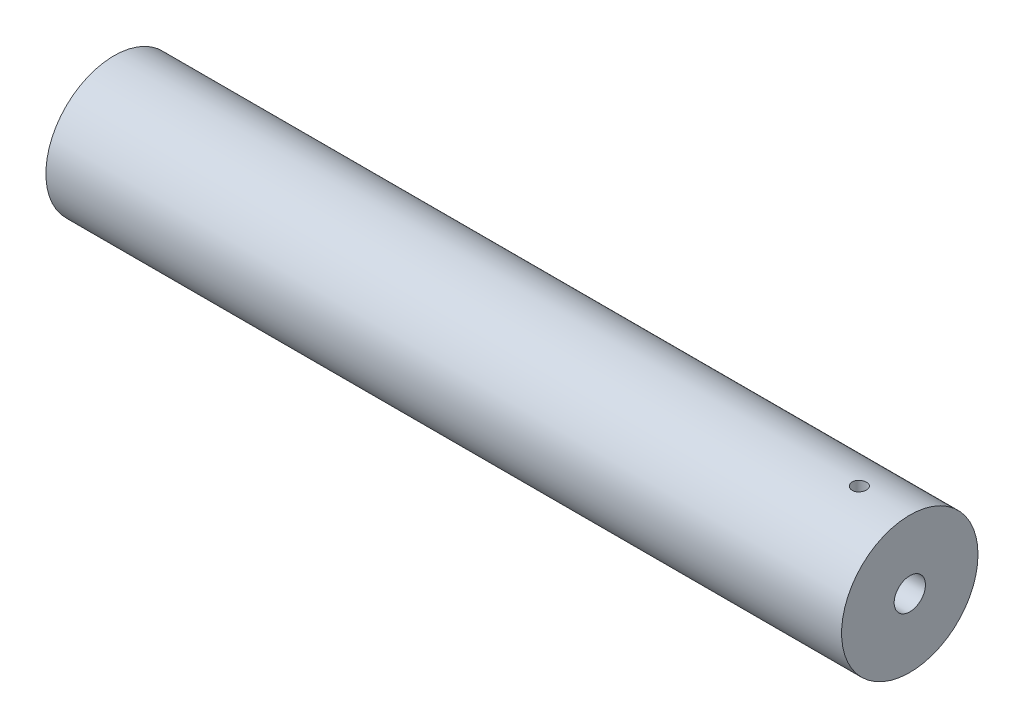
ISO-10303-21;
HEADER;
FILE_DESCRIPTION(('STEP AP214'),'2;1');
FILE_NAME('part.step','',(''),(''),'','','');
FILE_SCHEMA(('AUTOMOTIVE_DESIGN { 1 0 10303 214 1 1 1 1 }'));
ENDSEC;
DATA;
#1=APPLICATION_CONTEXT('core data for automotive mechanical design processes');
#2=APPLICATION_PROTOCOL_DEFINITION('international standard','automotive_design',2000,#1);
#3=PRODUCT_CONTEXT('',#1,'mechanical');
#4=PRODUCT('Part','Part','',(#3));
#5=PRODUCT_RELATED_PRODUCT_CATEGORY('part','',(#4));
#6=PRODUCT_DEFINITION_FORMATION('','',#4);
#7=PRODUCT_DEFINITION_CONTEXT('part definition',#1,'design');
#8=PRODUCT_DEFINITION('design','',#6,#7);
#9=PRODUCT_DEFINITION_SHAPE('','',#8);
#10=(LENGTH_UNIT() NAMED_UNIT(*) SI_UNIT(.MILLI.,.METRE.));
#11=(NAMED_UNIT(*) PLANE_ANGLE_UNIT() SI_UNIT($,.RADIAN.));
#12=(NAMED_UNIT(*) SI_UNIT($,.STERADIAN.) SOLID_ANGLE_UNIT());
#13=UNCERTAINTY_MEASURE_WITH_UNIT(LENGTH_MEASURE(1.E-05),#10,'distance_accuracy_value','');
#14=(GEOMETRIC_REPRESENTATION_CONTEXT(3) GLOBAL_UNCERTAINTY_ASSIGNED_CONTEXT((#13)) GLOBAL_UNIT_ASSIGNED_CONTEXT((#10,
#11,#12)) REPRESENTATION_CONTEXT('',''));
#15=CARTESIAN_POINT('',(0.,0.,0.));
#16=DIRECTION('',(0.,0.,1.));
#17=DIRECTION('',(1.,0.,0.));
#18=AXIS2_PLACEMENT_3D('',#15,#16,#17);
#19=CARTESIAN_POINT('',(131.130079525463,-120.,0.));
#20=DIRECTION('',(0.,1.,0.));
#21=DIRECTION('',(0.,0.,1.));
#22=AXIS2_PLACEMENT_3D('',#19,#20,#21);
#23=CYLINDRICAL_SURFACE('',#22,1.25000000000001);
#24=CARTESIAN_POINT('',(131.130079525463,-2.44948974278317,1.25000000000001));
#25=CARTESIAN_POINT('',(131.196087954239,-2.44949368228764,1.24999649350402));
#26=CARTESIAN_POINT('',(131.262199347476,-2.45219701957714,1.2447378244484));
#27=CARTESIAN_POINT('',(131.392461876427,-2.46264090706275,1.22393957837269));
#28=CARTESIAN_POINT('',(131.456607776006,-2.47039386281898,1.20837468013773));
#29=CARTESIAN_POINT('',(131.580818059726,-2.48986254372279,1.16772642001969));
#30=CARTESIAN_POINT('',(131.640899759733,-2.50155999360654,1.14268689094075));
#31=CARTESIAN_POINT('',(131.7559946184,-2.52757186133795,1.08393224916965));
#32=CARTESIAN_POINT('',(131.811008313043,-2.54188600196966,1.05021805532982));
#33=CARTESIAN_POINT('',(131.918526662095,-2.57270625364896,0.972392408700594));
#34=CARTESIAN_POINT('',(131.970610757711,-2.58929511801968,0.927732432282898));
#35=CARTESIAN_POINT('',(132.06686779967,-2.62212163999063,0.830430066961095));
#36=CARTESIAN_POINT('',(132.111037338476,-2.63835914368329,0.777784257759791));
#37=CARTESIAN_POINT('',(132.192505091893,-2.66969243866209,0.662562027156257));
#38=CARTESIAN_POINT('',(132.229310872708,-2.68468107121253,0.599605600022176));
#39=CARTESIAN_POINT('',(132.291622021179,-2.71078910043921,0.467587746509033));
#40=CARTESIAN_POINT('',(132.317133313559,-2.72191052506912,0.398529543785725));
#41=CARTESIAN_POINT('',(132.354546692516,-2.73844039615752,0.260702263713044));
#42=CARTESIAN_POINT('',(132.367179274127,-2.74415398467794,0.192168860207251));
#43=CARTESIAN_POINT('',(132.380856765775,-2.75034616684861,0.0537337492110859));
#44=CARTESIAN_POINT('',(132.381907340996,-2.75082731987365,-0.0161672725634469));
#45=CARTESIAN_POINT('',(132.372730512016,-2.74666518415707,-0.149965080853608));
#46=CARTESIAN_POINT('',(132.363311657815,-2.74238926124843,-0.2139310798263));
#47=CARTESIAN_POINT('',(132.334875592288,-2.72972015837754,-0.339258309266323));
#48=CARTESIAN_POINT('',(132.315857669237,-2.72132667311912,-0.40061934622245));
#49=CARTESIAN_POINT('',(132.268569509568,-2.70105493201454,-0.520129625913231));
#50=CARTESIAN_POINT('',(132.24016363026,-2.68912586975713,-0.578216222535312));
#51=CARTESIAN_POINT('',(132.17505685861,-2.66291017293157,-0.68894998656134));
#52=CARTESIAN_POINT('',(132.13835292804,-2.64862267537057,-0.741595151340284));
#53=CARTESIAN_POINT('',(132.054229769819,-2.61770923899541,-0.844521462680999));
#54=CARTESIAN_POINT('',(132.006180878326,-2.60098761803526,-0.894259880394277));
#55=CARTESIAN_POINT('',(131.90246240245,-2.56790977516793,-0.985234665281759));
#56=CARTESIAN_POINT('',(131.846788708995,-2.55155375585301,-1.02646641790382));
#57=CARTESIAN_POINT('',(131.726269575822,-2.52029978809172,-1.10104506894184));
#58=CARTESIAN_POINT('',(131.661123275473,-2.50550118974752,-1.13395121798235));
#59=CARTESIAN_POINT('',(131.525369195309,-2.48028797326794,-1.18809667415592));
#60=CARTESIAN_POINT('',(131.454766225228,-2.46986954528397,-1.20934612514666));
#61=CARTESIAN_POINT('',(131.315551315028,-2.45559834607938,-1.23805393738083));
#62=CARTESIAN_POINT('',(131.247167214568,-2.45132366398272,-1.2464018641072));
#63=CARTESIAN_POINT('',(131.109856228252,-2.44861334601462,-1.25172089001373));
#64=CARTESIAN_POINT('',(131.040929614163,-2.4501749518254,-1.24869736351008));
#65=CARTESIAN_POINT('',(130.910511258509,-2.45851920297553,-1.23217422693462));
#66=CARTESIAN_POINT('',(130.848875197682,-2.46486058692079,-1.21955926621108));
#67=CARTESIAN_POINT('',(130.728671928036,-2.48144703005368,-1.18544405201491));
#68=CARTESIAN_POINT('',(130.67010553996,-2.49169312725521,-1.16394143575356));
#69=CARTESIAN_POINT('',(130.554714289263,-2.51549375704146,-1.11159822979468));
#70=CARTESIAN_POINT('',(130.498089153042,-2.52917735570445,-1.08037807246867));
#71=CARTESIAN_POINT('',(130.390579924912,-2.55815836558198,-1.00984087724325));
#72=CARTESIAN_POINT('',(130.339698618428,-2.57345655287928,-0.97051993682405));
#73=CARTESIAN_POINT('',(130.239798219525,-2.60579094908277,-0.880267857698446));
#74=CARTESIAN_POINT('',(130.191477291788,-2.62284763397896,-0.828567938261544));
#75=CARTESIAN_POINT('',(130.104030412188,-2.65539591051489,-0.717441468187298));
#76=CARTESIAN_POINT('',(130.064906031443,-2.67088723447428,-0.658013600012931));
#77=CARTESIAN_POINT('',(129.996682042138,-2.69881612600612,-0.532064634336928));
#78=CARTESIAN_POINT('',(129.967699331786,-2.71121763780736,-0.465471699055611));
#79=CARTESIAN_POINT('',(129.921599069129,-2.73129834562412,-0.327635980482068));
#80=CARTESIAN_POINT('',(129.904472967649,-2.73898094374761,-0.256396588146305));
#81=CARTESIAN_POINT('',(129.883791935399,-2.74830068808534,-0.117466176582608));
#82=CARTESIAN_POINT('',(129.879257831228,-2.75037367442807,-0.0499494636179563));
#83=CARTESIAN_POINT('',(129.881145397558,-2.74951533998594,0.0848898576599922));
#84=CARTESIAN_POINT('',(129.887564430947,-2.74658522376394,0.15221250878732));
#85=CARTESIAN_POINT('',(129.910482302736,-2.73629690997646,0.281391999197476));
#86=CARTESIAN_POINT('',(129.926483425803,-2.72915761294651,0.343356169931394));
#87=CARTESIAN_POINT('',(129.9675145692,-2.71131278427637,0.463664188063018));
#88=CARTESIAN_POINT('',(129.992546121148,-2.70060664770133,0.522007419358057));
#89=CARTESIAN_POINT('',(130.052178066892,-2.6760233581899,0.636378008545805));
#90=CARTESIAN_POINT('',(130.087163708767,-2.66202358016365,0.692177439915805));
#91=CARTESIAN_POINT('',(130.165190306005,-2.63243399966462,0.797359045105189));
#92=CARTESIAN_POINT('',(130.208234781832,-2.61684350365392,0.846738398309331));
#93=CARTESIAN_POINT('',(130.305322290193,-2.58417614823031,0.941951228398695));
#94=CARTESIAN_POINT('',(130.359980422705,-2.56708296999995,0.987154004244772));
#95=CARTESIAN_POINT('',(130.47653812512,-2.53455914709153,1.06790018403237));
#96=CARTESIAN_POINT('',(130.53844242996,-2.5191296022894,1.10343722102545));
#97=CARTESIAN_POINT('',(130.668591982971,-2.49176565985743,1.16392442382467));
#98=CARTESIAN_POINT('',(130.736883750486,-2.47986003874526,1.18878813351711));
#99=CARTESIAN_POINT('',(130.877315359654,-2.46152275925821,1.22631765086684));
#100=CARTESIAN_POINT('',(130.949441414717,-2.45507273502283,1.23902440311468));
#101=CARTESIAN_POINT('',(131.04007062356,-2.45107611117236,1.24688636059437));
#102=CARTESIAN_POINT('',(131.058044969236,-2.45048261290848,1.24805272823734));
#103=CARTESIAN_POINT('',(131.09403682475,-2.44968888381115,1.24961004053751));
#104=CARTESIAN_POINT('',(131.112054336106,-2.44948866700671,1.25000095753309));
#105=CARTESIAN_POINT('',(131.130079525463,-2.44948974278317,1.25000000000001));
#106=B_SPLINE_CURVE_WITH_KNOTS('',3,(#24,#25,#26,#27,#28,#29,#30,#31,#32,#33,#34,#35,#36,#37,
#38,#39,#40,#41,#42,#43,#44,#45,#46,#47,#48,#49,#50,#51,#52,#53,#54,#55,#56,#57,#58,#59,#60,#61,
#62,#63,#64,#65,#66,#67,#68,#69,#70,#71,#72,#73,#74,#75,#76,#77,#78,#79,#80,#81,#82,#83,#84,#85,
#86,#87,#88,#89,#90,#91,#92,#93,#94,#95,#96,#97,#98,#99,#100,#101,#102,#103,#104,#105),
.UNSPECIFIED.,.T.,.F.,(4,2,2,2,2,2,2,2,2,2,2,2,2,2,2,2,2,2,2,2,2,2,2,2,2,2,2,2,2,2,2,2,2,2,2,2,
2,2,2,2,4),(0.,0.197949490145144,0.396387132894544,0.593917744022077,0.791427440589931,
1.00227982105291,1.21322276498811,1.43542192427069,1.65750438655094,1.86613997239169,
2.07467350237463,2.26815547775456,2.4616518010012,2.65807591784025,2.85457206969011,
3.06708946120134,3.27972183419203,3.50196731162579,3.72401907920022,3.92994297853527,
4.13576956743686,4.3246193340775,4.51351933887033,4.71099397075561,4.90856395864767,
5.12594226056981,5.34335767200036,5.56320241144762,5.78288846688931,5.98493699995735,
6.18693689403811,6.37925788088373,6.57161150192548,6.7727617644371,6.97400010437294,
7.19187634216839,7.40989575221216,7.62964928571057,7.84866005711312,7.90271299908982,
7.95676786918966),.UNSPECIFIED.);
#107=CARTESIAN_POINT('',(131.130079525463,-2.44948974278317,1.25000000000001));
#108=VERTEX_POINT('',#107);
#109=EDGE_CURVE('E36',#108,#108,#106,.T.);
#110=ORIENTED_EDGE('',*,*,#109,.T.);
#111=EDGE_LOOP('',(#110));
#112=FACE_BOUND('',#111,.T.);
#113=CARTESIAN_POINT('',(131.130079525463,-11.93471826228,1.25000000000001));
#114=CARTESIAN_POINT('',(131.200087913137,-11.9347191150424,1.24999697518323));
#115=CARTESIAN_POINT('',(131.270142207859,-11.9353409008733,1.24409877692398));
#116=CARTESIAN_POINT('',(131.408307407552,-11.9377604270999,1.2206594304104));
#117=CARTESIAN_POINT('',(131.476416102589,-11.9395594532585,1.20310555170273));
#118=CARTESIAN_POINT('',(131.608669321708,-11.9441275217712,1.15687251656013));
#119=CARTESIAN_POINT('',(131.672816264196,-11.9468959653314,1.12820022662262));
#120=CARTESIAN_POINT('',(131.795373715064,-11.9530902004971,1.06055770334254));
#121=CARTESIAN_POINT('',(131.853785335611,-11.9565158642756,1.02158947197069));
#122=CARTESIAN_POINT('',(131.963457343323,-11.9636536449667,0.934296678407964));
#123=CARTESIAN_POINT('',(132.014691984327,-11.967366722546,0.885939844855307));
#124=CARTESIAN_POINT('',(132.108333856255,-11.9746522541305,0.781311583098987));
#125=CARTESIAN_POINT('',(132.150740678094,-11.9782247016127,0.725039788315117));
#126=CARTESIAN_POINT('',(132.225612728019,-11.9848360068635,0.606020494104257));
#127=CARTESIAN_POINT('',(132.25805507834,-11.987873629993,0.543258528434162));
#128=CARTESIAN_POINT('',(132.31193088172,-11.99306255589,0.413140786628821));
#129=CARTESIAN_POINT('',(132.333364624256,-11.9952138819629,0.345785131339842));
#130=CARTESIAN_POINT('',(132.364539024554,-11.9983810704125,0.208652729588993));
#131=CARTESIAN_POINT('',(132.374322065215,-11.999401047473,0.138885714600337));
#132=CARTESIAN_POINT('',(132.382048529513,-12.0002046174434,-0.00130690592327248));
#133=CARTESIAN_POINT('',(132.379992284224,-11.9999882449266,-0.0717324929869605));
#134=CARTESIAN_POINT('',(132.364132884052,-11.9983468568877,-0.210955320524854));
#135=CARTESIAN_POINT('',(132.350375304594,-11.9969265307067,-0.279757815683575));
#136=CARTESIAN_POINT('',(132.311574800649,-11.9930422118587,-0.414071941104603));
#137=CARTESIAN_POINT('',(132.286531718941,-11.990578204652,-0.479583525506795));
#138=CARTESIAN_POINT('',(132.225821349141,-11.9848754491254,-0.605599466983953));
#139=CARTESIAN_POINT('',(132.190133960767,-11.981635237351,-0.666094071486253));
#140=CARTESIAN_POINT('',(132.109162610283,-11.974743492089,-0.78025242021022));
#141=CARTESIAN_POINT('',(132.063878342623,-11.9710919455069,-0.833915946854708));
#142=CARTESIAN_POINT('',(131.964742528846,-11.963766675583,-0.933155896006389));
#143=CARTESIAN_POINT('',(131.910851324876,-11.9600929292666,-0.978692709827728));
#144=CARTESIAN_POINT('',(131.796168717239,-11.9531545861231,-1.06007978169066));
#145=CARTESIAN_POINT('',(131.735377302113,-11.9498899899754,-1.09593002364597));
#146=CARTESIAN_POINT('',(131.608588744712,-11.944139339682,-1.15692647329621));
#147=CARTESIAN_POINT('',(131.542590363595,-11.9416534715147,-1.18207012452017));
#148=CARTESIAN_POINT('',(131.40727686407,-11.9377455447301,-1.22090774282747));
#149=CARTESIAN_POINT('',(131.337961855586,-11.9363234508818,-1.2346020891004));
#150=CARTESIAN_POINT('',(131.198330738969,-11.9347102430423,-1.2501011877722));
#151=CARTESIAN_POINT('',(131.128020850827,-11.9345133869079,-1.25196140238157));
#152=CARTESIAN_POINT('',(130.988090374799,-11.9353577854573,-1.24388519226923));
#153=CARTESIAN_POINT('',(130.918469776806,-11.9363990219608,-1.23394894076647));
#154=CARTESIAN_POINT('',(130.782056504352,-11.9395970583523,-1.2026083));
#155=CARTESIAN_POINT('',(130.715257717741,-11.9417512975577,-1.18123023085879));
#156=CARTESIAN_POINT('',(130.586194065028,-11.9469305336369,-1.12763970354661));
#157=CARTESIAN_POINT('',(130.523929311365,-11.9499555520955,-1.09542697680143));
#158=CARTESIAN_POINT('',(130.405448676125,-11.9565493817568,-1.02094298796708));
#159=CARTESIAN_POINT('',(130.349255974211,-11.9601201592886,-0.978635031111946));
#160=CARTESIAN_POINT('',(130.244749824107,-11.967396775493,-0.885214034353472));
#161=CARTESIAN_POINT('',(130.196436587775,-11.9711026177939,-0.834100757774533));
#162=CARTESIAN_POINT('',(130.108869002342,-11.9782491893122,-0.724279176687235));
#163=CARTESIAN_POINT('',(130.069650874505,-11.9816888233373,-0.665541909470576));
#164=CARTESIAN_POINT('',(130.001636222155,-11.9878994174722,-0.542282402189472));
#165=CARTESIAN_POINT('',(129.972839544344,-11.9906703874177,-0.477760247237067));
#166=CARTESIAN_POINT('',(129.926546362289,-11.9952265074374,-0.344888025233447));
#167=CARTESIAN_POINT('',(129.909028124505,-11.9970135525649,-0.276545597858203));
#168=CARTESIAN_POINT('',(129.88571820293,-11.9994082618957,-0.137869776943755));
#169=CARTESIAN_POINT('',(129.879926159536,-12.0000159622655,-0.0675364445258053));
#170=CARTESIAN_POINT('',(129.880238346049,-11.9999834694783,0.0727692297747856));
#171=CARTESIAN_POINT('',(129.886286404537,-11.9993491685798,0.142741704768525));
#172=CARTESIAN_POINT('',(129.909989145783,-11.996915580434,0.28067073653074));
#173=CARTESIAN_POINT('',(129.927643835457,-11.9951162924927,0.348627292098231));
#174=CARTESIAN_POINT('',(129.974042796885,-11.990554266156,0.480593939441451));
#175=CARTESIAN_POINT('',(130.00278526139,-11.9877916847795,0.544604672394921));
#176=CARTESIAN_POINT('',(130.070537943592,-11.9816107070057,0.66690223344495));
#177=CARTESIAN_POINT('',(130.109548129275,-11.9781923126532,0.725189079387065));
#178=CARTESIAN_POINT('',(130.196939206986,-11.9710630656975,0.834672111183006));
#179=CARTESIAN_POINT('',(130.245361941914,-11.9673509527786,0.885834816188318));
#180=CARTESIAN_POINT('',(130.350120044698,-11.960063235384,0.979332809391564));
#181=CARTESIAN_POINT('',(130.40645730433,-11.9564876638058,1.02166598107296));
#182=CARTESIAN_POINT('',(130.525615558354,-11.9498674099473,1.09639613404271));
#183=CARTESIAN_POINT('',(130.588453868213,-11.94682420674,1.12876561682157));
#184=CARTESIAN_POINT('',(130.718666334396,-11.9416308093055,1.18244985814836));
#185=CARTESIAN_POINT('',(130.786035305687,-11.9394796137875,1.203777018579));
#186=CARTESIAN_POINT('',(130.899830764033,-11.9368532731593,1.22948475987797));
#187=CARTESIAN_POINT('',(130.945531080292,-11.9360564602914,1.23716737923509));
#188=CARTESIAN_POINT('',(131.03750741612,-11.9349886741132,1.24742598754875));
#189=CARTESIAN_POINT('',(131.083783433006,-11.9347176983538,1.25000200029172));
#190=CARTESIAN_POINT('',(131.130079525463,-11.93471826228,1.25000000000001));
#191=B_SPLINE_CURVE_WITH_KNOTS('',3,(#113,#114,#115,#116,#117,#118,#119,#120,#121,#122,#123,
#124,#125,#126,#127,#128,#129,#130,#131,#132,#133,#134,#135,#136,#137,#138,#139,#140,#141,#142,
#143,#144,#145,#146,#147,#148,#149,#150,#151,#152,#153,#154,#155,#156,#157,#158,#159,#160,#161,
#162,#163,#164,#165,#166,#167,#168,#169,#170,#171,#172,#173,#174,#175,#176,#177,#178,#179,#180,
#181,#182,#183,#184,#185,#186,#187,#188,#189,#190),.UNSPECIFIED.,.T.,.F.,(4,2,2,2,2,2,2,2,2,2,2,
2,2,2,2,2,2,2,2,2,2,2,2,2,2,2,2,2,2,2,2,2,2,2,2,2,2,2,4),(0.,0.209856088918112,
0.419941762656918,0.629897897997531,0.839813238904348,1.05046331966471,1.2611231598655,
1.47226310667902,1.68339750117152,1.89376146209514,2.10411954043859,2.31366202924335,
2.52320743729405,2.73315107506366,2.94310139809175,3.15404859825979,3.36499614874126,
3.57599404011222,3.786984943166,3.99698627668494,4.20698452658868,4.41650177142427,
4.62602421024737,4.83632015771438,5.04662175854645,5.25774702917371,5.4688691940614,
5.67958329938648,5.89029094273987,6.10000137609485,6.3097119343823,6.51938832536299,
6.7290640626077,6.93969414529676,7.15037465998276,7.36163151780616,7.57265059074997,
7.7114277069325,7.85020417669341),.UNSPECIFIED.);
#192=CARTESIAN_POINT('',(131.130079525463,-11.93471826228,1.25000000000001));
#193=VERTEX_POINT('',#192);
#194=EDGE_CURVE('E50',#193,#193,#191,.T.);
#195=ORIENTED_EDGE('',*,*,#194,.F.);
#196=EDGE_LOOP('',(#195));
#197=FACE_BOUND('',#196,.T.);
#198=ADVANCED_FACE('F31',(#112,#197),#23,.F.);
#199=CARTESIAN_POINT('',(140.,0.,0.));
#200=DIRECTION('',(-1.,0.,0.));
#201=DIRECTION('',(0.,0.,1.));
#202=AXIS2_PLACEMENT_3D('',#199,#200,#201);
#203=CYLINDRICAL_SURFACE('',#202,12.);
#204=ORIENTED_EDGE('',*,*,#194,.T.);
#205=EDGE_LOOP('',(#204));
#206=FACE_BOUND('',#205,.T.);
#207=CARTESIAN_POINT('',(131.130079525463,11.93471826228,1.25000000000001));
#208=CARTESIAN_POINT('',(131.060071137788,11.9347191150424,1.24999697518323));
#209=CARTESIAN_POINT('',(130.990016843067,11.9353409008733,1.24409877692398));
#210=CARTESIAN_POINT('',(130.851851643374,11.9377604270999,1.2206594304104));
#211=CARTESIAN_POINT('',(130.783742948337,11.9395594532585,1.20310555170273));
#212=CARTESIAN_POINT('',(130.651489729217,11.9441275217712,1.15687251656013));
#213=CARTESIAN_POINT('',(130.587342786729,11.9468959653314,1.12820022662262));
#214=CARTESIAN_POINT('',(130.464785335861,11.9530902004971,1.06055770334254));
#215=CARTESIAN_POINT('',(130.406373715314,11.9565158642756,1.02158947197069));
#216=CARTESIAN_POINT('',(130.296701707602,11.9636536449667,0.934296678407964));
#217=CARTESIAN_POINT('',(130.245467066598,11.967366722546,0.885939844855307));
#218=CARTESIAN_POINT('',(130.15182519467,11.9746522541305,0.781311583098987));
#219=CARTESIAN_POINT('',(130.109418372831,11.9782247016127,0.725039788315117));
#220=CARTESIAN_POINT('',(130.034546322907,11.9848360068635,0.606020494104257));
#221=CARTESIAN_POINT('',(130.002103972585,11.987873629993,0.543258528434162));
#222=CARTESIAN_POINT('',(129.948228169205,11.99306255589,0.413140786628821));
#223=CARTESIAN_POINT('',(129.926794426669,11.9952138819629,0.345785131339842));
#224=CARTESIAN_POINT('',(129.895620026371,11.9983810704125,0.208652729588994));
#225=CARTESIAN_POINT('',(129.88583698571,11.999401047473,0.138885714600338));
#226=CARTESIAN_POINT('',(129.878110521412,12.0002046174434,-0.00130690592327157));
#227=CARTESIAN_POINT('',(129.880166766702,11.9999882449266,-0.0717324929869604));
#228=CARTESIAN_POINT('',(129.896026166874,11.9983468568877,-0.210955320524846));
#229=CARTESIAN_POINT('',(129.909783746331,11.9969265307067,-0.27975781568356));
#230=CARTESIAN_POINT('',(129.948584250277,11.9930422118587,-0.414071941104588));
#231=CARTESIAN_POINT('',(129.973627331984,11.990578204652,-0.479583525506789));
#232=CARTESIAN_POINT('',(130.034337701784,11.9848754491254,-0.605599466983953));
#233=CARTESIAN_POINT('',(130.070025090158,11.981635237351,-0.666094071486252));
#234=CARTESIAN_POINT('',(130.150996440643,11.974743492089,-0.78025242021022));
#235=CARTESIAN_POINT('',(130.196280708302,11.9710919455069,-0.833915946854709));
#236=CARTESIAN_POINT('',(130.295416522079,11.963766675583,-0.933155896006379));
#237=CARTESIAN_POINT('',(130.349307726049,11.9600929292666,-0.978692709827707));
#238=CARTESIAN_POINT('',(130.463990333686,11.9531545861231,-1.06007978169064));
#239=CARTESIAN_POINT('',(130.524781748812,11.9498899899754,-1.09593002364596));
#240=CARTESIAN_POINT('',(130.651570306213,11.944139339682,-1.15692647329621));
#241=CARTESIAN_POINT('',(130.71756868733,11.9416534715147,-1.18207012452017));
#242=CARTESIAN_POINT('',(130.852882186855,11.9377455447301,-1.22090774282747));
#243=CARTESIAN_POINT('',(130.92219719534,11.9363234508818,-1.2346020891004));
#244=CARTESIAN_POINT('',(131.061828311957,11.9347102430423,-1.2501011877722));
#245=CARTESIAN_POINT('',(131.132138200098,11.9345133869079,-1.25196140238157));
#246=CARTESIAN_POINT('',(131.272068676127,11.9353577854573,-1.24388519226923));
#247=CARTESIAN_POINT('',(131.34168927412,11.9363990219608,-1.23394894076647));
#248=CARTESIAN_POINT('',(131.478102546573,11.9395970583523,-1.2026083));
#249=CARTESIAN_POINT('',(131.544901333184,11.9417512975577,-1.18123023085879));
#250=CARTESIAN_POINT('',(131.673964985897,11.9469305336369,-1.12763970354661));
#251=CARTESIAN_POINT('',(131.736229739561,11.9499555520955,-1.09542697680143));
#252=CARTESIAN_POINT('',(131.8547103748,11.9565493817568,-1.02094298796707));
#253=CARTESIAN_POINT('',(131.910903076715,11.9601201592886,-0.978635031111929));
#254=CARTESIAN_POINT('',(132.015409226819,11.967396775493,-0.885214034353451));
#255=CARTESIAN_POINT('',(132.06372246315,11.9711026177939,-0.834100757774522));
#256=CARTESIAN_POINT('',(132.151290048584,11.9782491893122,-0.724279176687235));
#257=CARTESIAN_POINT('',(132.19050817642,11.9816888233373,-0.665541909470576));
#258=CARTESIAN_POINT('',(132.25852282877,11.9878994174722,-0.542282402189472));
#259=CARTESIAN_POINT('',(132.287319506581,11.9906703874177,-0.477760247237066));
#260=CARTESIAN_POINT('',(132.333612688637,11.9952265074374,-0.344888025233447));
#261=CARTESIAN_POINT('',(132.35113092642,11.9970135525649,-0.276545597858203));
#262=CARTESIAN_POINT('',(132.374440847996,11.9994082618957,-0.137869776943755));
#263=CARTESIAN_POINT('',(132.380232891389,12.0000159622655,-0.0675364445258052));
#264=CARTESIAN_POINT('',(132.379920704876,11.9999834694783,0.072769229774784));
#265=CARTESIAN_POINT('',(132.373872646388,11.9993491685798,0.142741704768522));
#266=CARTESIAN_POINT('',(132.350169905142,11.996915580434,0.280670736530737));
#267=CARTESIAN_POINT('',(132.332515215469,11.9951162924927,0.34862729209823));
#268=CARTESIAN_POINT('',(132.28611625404,11.990554266156,0.480593939441451));
#269=CARTESIAN_POINT('',(132.257373789535,11.9877916847795,0.544604672394921));
#270=CARTESIAN_POINT('',(132.189621107334,11.9816107070057,0.666902233444949));
#271=CARTESIAN_POINT('',(132.15061092165,11.9781923126532,0.725189079387065));
#272=CARTESIAN_POINT('',(132.063219843939,11.9710630656975,0.834672111183016));
#273=CARTESIAN_POINT('',(132.014797109011,11.9673509527786,0.885834816188338));
#274=CARTESIAN_POINT('',(131.910039006228,11.960063235384,0.979332809391581));
#275=CARTESIAN_POINT('',(131.853701746596,11.9564876638058,1.02166598107296));
#276=CARTESIAN_POINT('',(131.734543492572,11.9498674099473,1.09639613404271));
#277=CARTESIAN_POINT('',(131.671705182713,11.94682420674,1.12876561682157));
#278=CARTESIAN_POINT('',(131.541492716529,11.9416308093055,1.18244985814836));
#279=CARTESIAN_POINT('',(131.474123745238,11.9394796137875,1.203777018579));
#280=CARTESIAN_POINT('',(131.360328286892,11.9368532731593,1.22948475987797));
#281=CARTESIAN_POINT('',(131.314627970634,11.9360564602914,1.23716737923509));
#282=CARTESIAN_POINT('',(131.222651634806,11.9349886741132,1.24742598754875));
#283=CARTESIAN_POINT('',(131.176375617919,11.9347176983538,1.25000200029172));
#284=CARTESIAN_POINT('',(131.130079525463,11.93471826228,1.25000000000001));
#285=B_SPLINE_CURVE_WITH_KNOTS('',3,(#207,#208,#209,#210,#211,#212,#213,#214,#215,#216,#217,
#218,#219,#220,#221,#222,#223,#224,#225,#226,#227,#228,#229,#230,#231,#232,#233,#234,#235,#236,
#237,#238,#239,#240,#241,#242,#243,#244,#245,#246,#247,#248,#249,#250,#251,#252,#253,#254,#255,
#256,#257,#258,#259,#260,#261,#262,#263,#264,#265,#266,#267,#268,#269,#270,#271,#272,#273,#274,
#275,#276,#277,#278,#279,#280,#281,#282,#283,#284),.UNSPECIFIED.,.T.,.F.,(4,2,2,2,2,2,2,2,2,2,2,
2,2,2,2,2,2,2,2,2,2,2,2,2,2,2,2,2,2,2,2,2,2,2,2,2,2,2,4),(0.,0.209856088918112,
0.419941762656918,0.629897897997531,0.839813238904348,1.05046331966471,1.2611231598655,
1.47226310667902,1.68339750117152,1.89376146209514,2.10411954043859,2.31366202924332,
2.52320743729405,2.73315107506366,2.94310139809175,3.15404859825975,3.36499614874126,
3.57599404011222,3.786984943166,3.99698627668494,4.20698452658867,4.41650177142427,
4.62602421024737,4.83632015771441,5.04662175854645,5.25774702917371,5.4688691940614,
5.67958329938648,5.89029094273987,6.10000137609484,6.3097119343823,6.51938832536299,
6.72906406260769,6.93969414529679,7.15037465998276,7.36163151780615,7.57265059074997,
7.7114277069325,7.85020417669341),.UNSPECIFIED.);
#286=CARTESIAN_POINT('',(131.130079525463,11.93471826228,1.25000000000001));
#287=VERTEX_POINT('',#286);
#288=EDGE_CURVE('E56',#287,#287,#285,.T.);
#289=ORIENTED_EDGE('',*,*,#288,.T.);
#290=EDGE_LOOP('',(#289));
#291=FACE_BOUND('',#290,.T.);
#292=CARTESIAN_POINT('',(140.,0.,0.));
#293=DIRECTION('',(1.,0.,0.));
#294=DIRECTION('',(0.,0.,-1.));
#295=AXIS2_PLACEMENT_3D('',#292,#293,#294);
#296=CIRCLE('',#295,12.);
#297=CARTESIAN_POINT('',(140.,0.,-12.));
#298=VERTEX_POINT('',#297);
#299=EDGE_CURVE('E10',#298,#298,#296,.T.);
#300=ORIENTED_EDGE('',*,*,#299,.F.);
#301=EDGE_LOOP('',(#300));
#302=FACE_BOUND('',#301,.T.);
#303=CARTESIAN_POINT('',(0.,0.,0.));
#304=DIRECTION('',(1.,0.,0.));
#305=DIRECTION('',(0.,0.,-1.));
#306=AXIS2_PLACEMENT_3D('',#303,#304,#305);
#307=CIRCLE('',#306,12.);
#308=CARTESIAN_POINT('',(0.,0.,-12.));
#309=VERTEX_POINT('',#308);
#310=EDGE_CURVE('E45',#309,#309,#307,.T.);
#311=ORIENTED_EDGE('',*,*,#310,.T.);
#312=EDGE_LOOP('',(#311));
#313=FACE_BOUND('',#312,.T.);
#314=ADVANCED_FACE('F33',(#206,#291,#302,#313),#203,.T.);
#315=CARTESIAN_POINT('',(140.,0.,0.));
#316=DIRECTION('',(1.,0.,0.));
#317=DIRECTION('',(0.,0.,-1.));
#318=AXIS2_PLACEMENT_3D('',#315,#316,#317);
#319=PLANE('',#318);
#320=CARTESIAN_POINT('',(140.,0.,0.));
#321=DIRECTION('',(1.,0.,0.));
#322=DIRECTION('',(0.,0.,-1.));
#323=AXIS2_PLACEMENT_3D('',#320,#321,#322);
#324=CIRCLE('',#323,2.75);
#325=CARTESIAN_POINT('',(140.,0.,-2.75));
#326=VERTEX_POINT('',#325);
#327=EDGE_CURVE('E53',#326,#326,#324,.T.);
#328=ORIENTED_EDGE('',*,*,#327,.F.);
#329=EDGE_LOOP('',(#328));
#330=FACE_BOUND('',#329,.T.);
#331=ORIENTED_EDGE('',*,*,#299,.T.);
#332=EDGE_LOOP('',(#331));
#333=FACE_BOUND('',#332,.T.);
#334=ADVANCED_FACE('F74',(#330,#333),#319,.T.);
#335=CARTESIAN_POINT('',(0.,0.,0.));
#336=DIRECTION('',(1.,0.,0.));
#337=DIRECTION('',(0.,0.,-1.));
#338=AXIS2_PLACEMENT_3D('',#335,#336,#337);
#339=PLANE('',#338);
#340=CARTESIAN_POINT('',(0.,0.,0.));
#341=DIRECTION('',(-1.,0.,0.));
#342=DIRECTION('',(0.,0.,1.));
#343=AXIS2_PLACEMENT_3D('',#340,#341,#342);
#344=CIRCLE('',#343,4.);
#345=CARTESIAN_POINT('',(0.,0.,4.));
#346=VERTEX_POINT('',#345);
#347=EDGE_CURVE('E92',#346,#346,#344,.T.);
#348=ORIENTED_EDGE('',*,*,#347,.F.);
#349=EDGE_LOOP('',(#348));
#350=FACE_BOUND('',#349,.T.);
#351=ORIENTED_EDGE('',*,*,#310,.F.);
#352=EDGE_LOOP('',(#351));
#353=FACE_BOUND('',#352,.T.);
#354=ADVANCED_FACE('F70',(#350,#353),#339,.F.);
#355=CARTESIAN_POINT('',(131.130079525463,2.44948974278317,1.25000000000001));
#356=CARTESIAN_POINT('',(131.064071096686,2.44949368228764,1.24999649350402));
#357=CARTESIAN_POINT('',(130.997959703449,2.45219701957714,1.2447378244484));
#358=CARTESIAN_POINT('',(130.867697174499,2.46264090706274,1.2239395783727));
#359=CARTESIAN_POINT('',(130.80355127492,2.47039386281898,1.20837468013773));
#360=CARTESIAN_POINT('',(130.6793409912,2.48986254372279,1.16772642001969));
#361=CARTESIAN_POINT('',(130.619259291192,2.50155999360654,1.14268689094075));
#362=CARTESIAN_POINT('',(130.504164432525,2.52757186133795,1.08393224916965));
#363=CARTESIAN_POINT('',(130.449150737882,2.54188600196966,1.05021805532982));
#364=CARTESIAN_POINT('',(130.341632388831,2.57270625364896,0.972392408700594));
#365=CARTESIAN_POINT('',(130.289548293214,2.58929511801968,0.927732432282898));
#366=CARTESIAN_POINT('',(130.193291251255,2.62212163999063,0.830430066961095));
#367=CARTESIAN_POINT('',(130.149121712449,2.63835914368329,0.777784257759791));
#368=CARTESIAN_POINT('',(130.067653959032,2.66969243866209,0.662562027156257));
#369=CARTESIAN_POINT('',(130.030848178217,2.68468107121253,0.599605600022176));
#370=CARTESIAN_POINT('',(129.968537029746,2.71078910043921,0.467587746509033));
#371=CARTESIAN_POINT('',(129.943025737366,2.72191052506912,0.398529543785725));
#372=CARTESIAN_POINT('',(129.905612358409,2.73844039615752,0.260702263713044));
#373=CARTESIAN_POINT('',(129.892979776798,2.74415398467794,0.192168860207251));
#374=CARTESIAN_POINT('',(129.879302285151,2.75034616684861,0.0537337492110859));
#375=CARTESIAN_POINT('',(129.878251709929,2.75082731987365,-0.0161672725634469));
#376=CARTESIAN_POINT('',(129.887428538909,2.74666518415707,-0.149965080853608));
#377=CARTESIAN_POINT('',(129.89684739311,2.74238926124843,-0.2139310798263));
#378=CARTESIAN_POINT('',(129.925283458637,2.72972015837754,-0.339258309266323));
#379=CARTESIAN_POINT('',(129.944301381688,2.72132667311912,-0.40061934622245));
#380=CARTESIAN_POINT('',(129.991589541357,2.70105493201454,-0.520129625913231));
#381=CARTESIAN_POINT('',(130.019995420665,2.68912586975713,-0.578216222535312));
#382=CARTESIAN_POINT('',(130.085102192316,2.66291017293157,-0.68894998656134));
#383=CARTESIAN_POINT('',(130.121806122885,2.64862267537057,-0.741595151340284));
#384=CARTESIAN_POINT('',(130.205929281107,2.61770923899541,-0.844521462680999));
#385=CARTESIAN_POINT('',(130.2539781726,2.60098761803526,-0.894259880394277));
#386=CARTESIAN_POINT('',(130.357696648475,2.56790977516793,-0.985234665281759));
#387=CARTESIAN_POINT('',(130.413370341931,2.55155375585301,-1.02646641790382));
#388=CARTESIAN_POINT('',(130.533889475103,2.52029978809172,-1.10104506894184));
#389=CARTESIAN_POINT('',(130.599035775452,2.50550118974752,-1.13395121798235));
#390=CARTESIAN_POINT('',(130.734789855616,2.48028797326794,-1.18809667415592));
#391=CARTESIAN_POINT('',(130.805392825698,2.46986954528397,-1.20934612514666));
#392=CARTESIAN_POINT('',(130.944607735898,2.45559834607938,-1.23805393738083));
#393=CARTESIAN_POINT('',(131.012991836358,2.45132366398272,-1.2464018641072));
#394=CARTESIAN_POINT('',(131.150302822673,2.44861334601462,-1.25172089001373));
#395=CARTESIAN_POINT('',(131.219229436762,2.4501749518254,-1.24869736351008));
#396=CARTESIAN_POINT('',(131.349647792417,2.45851920297553,-1.23217422693462));
#397=CARTESIAN_POINT('',(131.411283853243,2.46486058692079,-1.21955926621108));
#398=CARTESIAN_POINT('',(131.531487122889,2.48144703005368,-1.18544405201491));
#399=CARTESIAN_POINT('',(131.590053510966,2.49169312725521,-1.16394143575356));
#400=CARTESIAN_POINT('',(131.705444761662,2.51549375704146,-1.11159822979468));
#401=CARTESIAN_POINT('',(131.762069897884,2.52917735570445,-1.08037807246867));
#402=CARTESIAN_POINT('',(131.869579126013,2.55815836558198,-1.00984087724325));
#403=CARTESIAN_POINT('',(131.920460432498,2.57345655287928,-0.97051993682405));
#404=CARTESIAN_POINT('',(132.0203608314,2.60579094908277,-0.880267857698446));
#405=CARTESIAN_POINT('',(132.068681759137,2.62284763397896,-0.828567938261544));
#406=CARTESIAN_POINT('',(132.156128638738,2.65539591051489,-0.717441468187298));
#407=CARTESIAN_POINT('',(132.195253019482,2.67088723447428,-0.658013600012931));
#408=CARTESIAN_POINT('',(132.263477008787,2.69881612600612,-0.53206463433693));
#409=CARTESIAN_POINT('',(132.29245971914,2.71121763780736,-0.465471699055617));
#410=CARTESIAN_POINT('',(132.338559981796,2.73129834562412,-0.327635980482074));
#411=CARTESIAN_POINT('',(132.355686083276,2.73898094374761,-0.256396588146308));
#412=CARTESIAN_POINT('',(132.376367115526,2.74830068808534,-0.117466176582608));
#413=CARTESIAN_POINT('',(132.380901219697,2.75037367442807,-0.0499494636179562));
#414=CARTESIAN_POINT('',(132.379013653367,2.74951533998594,0.0848898576599921));
#415=CARTESIAN_POINT('',(132.372594619979,2.74658522376394,0.15221250878732));
#416=CARTESIAN_POINT('',(132.349676748189,2.73629690997646,0.281391999197476));
#417=CARTESIAN_POINT('',(132.333675625122,2.72915761294651,0.343356169931395));
#418=CARTESIAN_POINT('',(132.292644481725,2.71131278427637,0.463664188063017));
#419=CARTESIAN_POINT('',(132.267612929777,2.70060664770133,0.522007419358056));
#420=CARTESIAN_POINT('',(132.207980984033,2.6760233581899,0.636378008545796));
#421=CARTESIAN_POINT('',(132.172995342158,2.66202358016365,0.692177439915789));
#422=CARTESIAN_POINT('',(132.09496874492,2.63243399966463,0.797359045105175));
#423=CARTESIAN_POINT('',(132.051924269094,2.61684350365392,0.846738398309324));
#424=CARTESIAN_POINT('',(131.954836760732,2.58417614823031,0.941951228398694));
#425=CARTESIAN_POINT('',(131.90017862822,2.56708296999995,0.987154004244771));
#426=CARTESIAN_POINT('',(131.783620925806,2.53455914709153,1.06790018403237));
#427=CARTESIAN_POINT('',(131.721716620965,2.5191296022894,1.10343722102545));
#428=CARTESIAN_POINT('',(131.591567067955,2.49176565985743,1.16392442382467));
#429=CARTESIAN_POINT('',(131.523275300439,2.47986003874526,1.18878813351711));
#430=CARTESIAN_POINT('',(131.382843691272,2.46152275925821,1.22631765086684));
#431=CARTESIAN_POINT('',(131.310717636208,2.45507273502283,1.23902440311468));
#432=CARTESIAN_POINT('',(131.220088427366,2.45107611117236,1.24688636059437));
#433=CARTESIAN_POINT('',(131.202114081689,2.45048261290848,1.24805272823734));
#434=CARTESIAN_POINT('',(131.166122226175,2.44968888381115,1.24961004053751));
#435=CARTESIAN_POINT('',(131.14810471482,2.44948866700671,1.25000095753309));
#436=CARTESIAN_POINT('',(131.130079525463,2.44948974278317,1.25000000000001));
#437=B_SPLINE_CURVE_WITH_KNOTS('',3,(#355,#356,#357,#358,#359,#360,#361,#362,#363,#364,#365,
#366,#367,#368,#369,#370,#371,#372,#373,#374,#375,#376,#377,#378,#379,#380,#381,#382,#383,#384,
#385,#386,#387,#388,#389,#390,#391,#392,#393,#394,#395,#396,#397,#398,#399,#400,#401,#402,#403,
#404,#405,#406,#407,#408,#409,#410,#411,#412,#413,#414,#415,#416,#417,#418,#419,#420,#421,#422,
#423,#424,#425,#426,#427,#428,#429,#430,#431,#432,#433,#434,#435,#436),.UNSPECIFIED.,.T.,.F.,(4,
2,2,2,2,2,2,2,2,2,2,2,2,2,2,2,2,2,2,2,2,2,2,2,2,2,2,2,2,2,2,2,2,2,2,2,2,2,2,2,4),(0.,
0.197949490145115,0.396387132894544,0.593917744022077,0.791427440589931,1.00227982105291,
1.21322276498811,1.43542192427069,1.65750438655094,1.86613997239169,2.07467350237463,
2.26815547775456,2.4616518010012,2.65807591784025,2.85457206969011,3.06708946120134,
3.27972183419203,3.50196731162579,3.72401907920022,3.92994297853527,4.13576956743686,
4.3246193340775,4.51351933887033,4.71099397075561,4.90856395864767,5.12594226056981,
5.34335767200036,5.56320241144761,5.78288846688931,5.98493699995735,6.18693689403811,
6.37925788088373,6.57161150192548,6.77276176443706,6.97400010437294,7.19187634216839,
7.40989575221216,7.62964928571057,7.84866005711313,7.90271299908982,7.95676786918966),.UNSPECIFIED.);
#438=CARTESIAN_POINT('',(131.130079525463,2.44948974278317,1.25000000000001));
#439=VERTEX_POINT('',#438);
#440=EDGE_CURVE('E78',#439,#439,#437,.T.);
#441=ORIENTED_EDGE('',*,*,#440,.T.);
#442=EDGE_LOOP('',(#441));
#443=FACE_BOUND('',#442,.T.);
#444=ORIENTED_EDGE('',*,*,#288,.F.);
#445=EDGE_LOOP('',(#444));
#446=FACE_BOUND('',#445,.T.);
#447=ADVANCED_FACE('F65',(#443,#446),#23,.F.);
#448=CARTESIAN_POINT('',(98.0000000000001,0.,0.));
#449=DIRECTION('',(1.,0.,0.));
#450=DIRECTION('',(0.,0.,-1.));
#451=AXIS2_PLACEMENT_3D('',#448,#449,#450);
#452=CYLINDRICAL_SURFACE('',#451,2.75);
#453=ORIENTED_EDGE('',*,*,#440,.F.);
#454=EDGE_LOOP('',(#453));
#455=FACE_BOUND('',#454,.T.);
#456=CARTESIAN_POINT('',(98.0000000000001,0.,0.));
#457=DIRECTION('',(1.,0.,0.));
#458=DIRECTION('',(0.,0.,-1.));
#459=AXIS2_PLACEMENT_3D('',#456,#457,#458);
#460=CIRCLE('',#459,2.75);
#461=CARTESIAN_POINT('',(98.0000000000001,0.,-2.75));
#462=VERTEX_POINT('',#461);
#463=EDGE_CURVE('E83',#462,#462,#460,.T.);
#464=ORIENTED_EDGE('',*,*,#463,.F.);
#465=EDGE_LOOP('',(#464));
#466=FACE_BOUND('',#465,.T.);
#467=ORIENTED_EDGE('',*,*,#327,.T.);
#468=EDGE_LOOP('',(#467));
#469=FACE_BOUND('',#468,.T.);
#470=ORIENTED_EDGE('',*,*,#109,.F.);
#471=EDGE_LOOP('',(#470));
#472=FACE_BOUND('',#471,.T.);
#473=ADVANCED_FACE('F69',(#455,#466,#469,#472),#452,.F.);
#474=CARTESIAN_POINT('',(98.0000000000001,0.,0.));
#475=DIRECTION('',(1.,0.,0.));
#476=DIRECTION('',(0.,0.,-1.));
#477=AXIS2_PLACEMENT_3D('',#474,#475,#476);
#478=PLANE('',#477);
#479=ORIENTED_EDGE('',*,*,#463,.T.);
#480=EDGE_LOOP('',(#479));
#481=FACE_BOUND('',#480,.T.);
#482=ADVANCED_FACE('F103',(#481),#478,.T.);
#483=CARTESIAN_POINT('',(70.,0.,0.));
#484=DIRECTION('',(-1.,0.,0.));
#485=DIRECTION('',(0.,0.,1.));
#486=AXIS2_PLACEMENT_3D('',#483,#484,#485);
#487=CYLINDRICAL_SURFACE('',#486,4.);
#488=CARTESIAN_POINT('',(70.,0.,0.));
#489=DIRECTION('',(-1.,0.,0.));
#490=DIRECTION('',(0.,0.,1.));
#491=AXIS2_PLACEMENT_3D('',#488,#489,#490);
#492=CIRCLE('',#491,4.);
#493=CARTESIAN_POINT('',(70.,0.,4.));
#494=VERTEX_POINT('',#493);
#495=EDGE_CURVE('E90',#494,#494,#492,.T.);
#496=ORIENTED_EDGE('',*,*,#495,.F.);
#497=EDGE_LOOP('',(#496));
#498=FACE_BOUND('',#497,.T.);
#499=ORIENTED_EDGE('',*,*,#347,.T.);
#500=EDGE_LOOP('',(#499));
#501=FACE_BOUND('',#500,.T.);
#502=ADVANCED_FACE('F100',(#498,#501),#487,.F.);
#503=CARTESIAN_POINT('',(70.,0.,0.));
#504=DIRECTION('',(-1.,0.,0.));
#505=DIRECTION('',(0.,0.,1.));
#506=AXIS2_PLACEMENT_3D('',#503,#504,#505);
#507=PLANE('',#506);
#508=ORIENTED_EDGE('',*,*,#495,.T.);
#509=EDGE_LOOP('',(#508));
#510=FACE_BOUND('',#509,.T.);
#511=ADVANCED_FACE('F98',(#510),#507,.T.);
#512=CLOSED_SHELL('',(#198,#314,#334,#354,#447,#473,#482,#502,#511));
#513=MANIFOLD_SOLID_BREP('B2',#512);
#514=ADVANCED_BREP_SHAPE_REPRESENTATION('',(#18,#513),#14);
#515=SHAPE_DEFINITION_REPRESENTATION(#9,#514);
ENDSEC;
END-ISO-10303-21;
